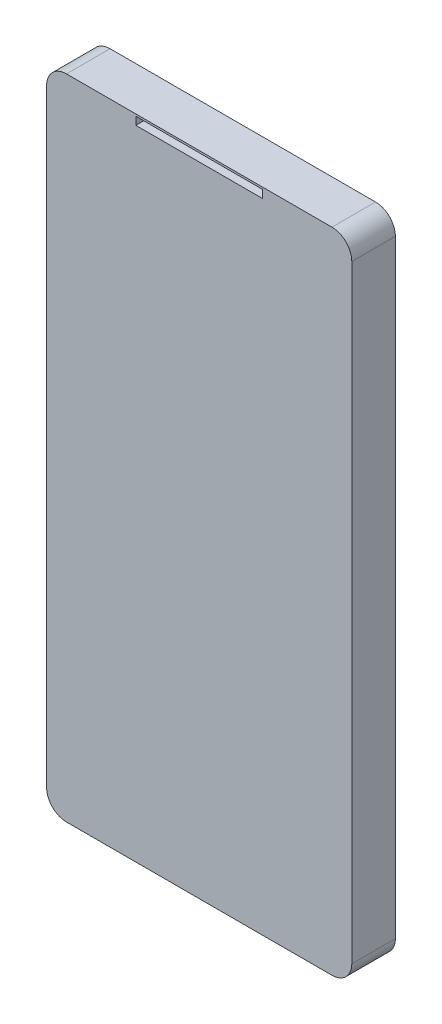
ISO-10303-21;
HEADER;
FILE_DESCRIPTION(('STEP AP214'),'2;1');
FILE_NAME('part.step','',(''),(''),'','','');
FILE_SCHEMA(('AUTOMOTIVE_DESIGN { 1 0 10303 214 1 1 1 1 }'));
ENDSEC;
DATA;
#1=APPLICATION_CONTEXT('core data for automotive mechanical design processes');
#2=APPLICATION_PROTOCOL_DEFINITION('international standard','automotive_design',2000,#1);
#3=PRODUCT_CONTEXT('',#1,'mechanical');
#4=PRODUCT('Part','Part','',(#3));
#5=PRODUCT_RELATED_PRODUCT_CATEGORY('part','',(#4));
#6=PRODUCT_DEFINITION_FORMATION('','',#4);
#7=PRODUCT_DEFINITION_CONTEXT('part definition',#1,'design');
#8=PRODUCT_DEFINITION('design','',#6,#7);
#9=PRODUCT_DEFINITION_SHAPE('','',#8);
#10=(LENGTH_UNIT() NAMED_UNIT(*) SI_UNIT(.MILLI.,.METRE.));
#11=(NAMED_UNIT(*) PLANE_ANGLE_UNIT() SI_UNIT($,.RADIAN.));
#12=(NAMED_UNIT(*) SI_UNIT($,.STERADIAN.) SOLID_ANGLE_UNIT());
#13=UNCERTAINTY_MEASURE_WITH_UNIT(LENGTH_MEASURE(1.E-05),#10,'distance_accuracy_value','');
#14=(GEOMETRIC_REPRESENTATION_CONTEXT(3) GLOBAL_UNCERTAINTY_ASSIGNED_CONTEXT((#13)) GLOBAL_UNIT_ASSIGNED_CONTEXT((#10,
#11,#12)) REPRESENTATION_CONTEXT('',''));
#15=CARTESIAN_POINT('',(0.,0.,0.));
#16=DIRECTION('',(0.,0.,1.));
#17=DIRECTION('',(1.,0.,0.));
#18=AXIS2_PLACEMENT_3D('',#15,#16,#17);
#19=CARTESIAN_POINT('',(0.,0.,0.));
#20=DIRECTION('',(0.,0.,1.));
#21=DIRECTION('',(1.,0.,0.));
#22=AXIS2_PLACEMENT_3D('',#19,#20,#21);
#23=PLANE('',#22);
#24=CARTESIAN_POINT('',(0.,0.,0.));
#25=DIRECTION('',(0.,0.,-1.));
#26=DIRECTION('',(1.,0.,0.));
#27=AXIS2_PLACEMENT_3D('',#24,#25,#26);
#28=CIRCLE('',#27,1.);
#29=CARTESIAN_POINT('',(1.,0.,0.));
#30=VERTEX_POINT('',#29);
#31=EDGE_CURVE('E529',#30,#30,#28,.T.);
#32=ORIENTED_EDGE('',*,*,#31,.F.);
#33=EDGE_LOOP('',(#32));
#34=FACE_BOUND('',#33,.T.);
#35=DIRECTION('',(0.,1.,0.));
#36=VECTOR('',#35,1.);
#37=CARTESIAN_POINT('',(38.5,81.75,0.));
#38=LINE('',#37,#36);
#39=CARTESIAN_POINT('',(38.5,-76.75,0.));
#40=VERTEX_POINT('',#39);
#41=CARTESIAN_POINT('',(38.5,76.75,0.));
#42=VERTEX_POINT('',#41);
#43=EDGE_CURVE('E571',#40,#42,#38,.T.);
#44=ORIENTED_EDGE('',*,*,#43,.F.);
#45=CARTESIAN_POINT('',(33.5,-76.75,0.));
#46=DIRECTION('',(0.,0.,1.));
#47=DIRECTION('',(1.,0.,0.));
#48=AXIS2_PLACEMENT_3D('',#45,#46,#47);
#49=CIRCLE('',#48,5.);
#50=CARTESIAN_POINT('',(33.5,-81.75,0.));
#51=VERTEX_POINT('',#50);
#52=EDGE_CURVE('E683',#40,#51,#49,.F.);
#53=ORIENTED_EDGE('',*,*,#52,.T.);
#54=DIRECTION('',(1.,0.,0.));
#55=VECTOR('',#54,1.);
#56=CARTESIAN_POINT('',(-38.5,-81.75,0.));
#57=LINE('',#56,#55);
#58=CARTESIAN_POINT('',(-33.5,-81.75,0.));
#59=VERTEX_POINT('',#58);
#60=EDGE_CURVE('E591',#59,#51,#57,.T.);
#61=ORIENTED_EDGE('',*,*,#60,.F.);
#62=CARTESIAN_POINT('',(-33.5,-76.75,0.));
#63=DIRECTION('',(0.,0.,1.));
#64=DIRECTION('',(1.,0.,0.));
#65=AXIS2_PLACEMENT_3D('',#62,#63,#64);
#66=CIRCLE('',#65,5.);
#67=CARTESIAN_POINT('',(-38.5,-76.75,0.));
#68=VERTEX_POINT('',#67);
#69=EDGE_CURVE('E680',#59,#68,#66,.F.);
#70=ORIENTED_EDGE('',*,*,#69,.T.);
#71=DIRECTION('',(0.,-1.,0.));
#72=VECTOR('',#71,1.);
#73=CARTESIAN_POINT('',(-38.5,81.75,0.));
#74=LINE('',#73,#72);
#75=CARTESIAN_POINT('',(-38.5,76.75,0.));
#76=VERTEX_POINT('',#75);
#77=EDGE_CURVE('E610',#76,#68,#74,.T.);
#78=ORIENTED_EDGE('',*,*,#77,.F.);
#79=CARTESIAN_POINT('',(-33.5,76.75,0.));
#80=DIRECTION('',(0.,0.,1.));
#81=DIRECTION('',(1.,0.,0.));
#82=AXIS2_PLACEMENT_3D('',#79,#80,#81);
#83=CIRCLE('',#82,5.);
#84=CARTESIAN_POINT('',(-33.5,81.75,0.));
#85=VERTEX_POINT('',#84);
#86=EDGE_CURVE('E677',#76,#85,#83,.F.);
#87=ORIENTED_EDGE('',*,*,#86,.T.);
#88=DIRECTION('',(-1.,0.,0.));
#89=VECTOR('',#88,1.);
#90=CARTESIAN_POINT('',(-38.5,81.75,0.));
#91=LINE('',#90,#89);
#92=CARTESIAN_POINT('',(33.5,81.75,0.));
#93=VERTEX_POINT('',#92);
#94=EDGE_CURVE('E606',#93,#85,#91,.T.);
#95=ORIENTED_EDGE('',*,*,#94,.F.);
#96=CARTESIAN_POINT('',(33.5,76.75,0.));
#97=DIRECTION('',(0.,0.,1.));
#98=DIRECTION('',(1.,0.,0.));
#99=AXIS2_PLACEMENT_3D('',#96,#97,#98);
#100=CIRCLE('',#99,5.);
#101=EDGE_CURVE('E674',#93,#42,#100,.F.);
#102=ORIENTED_EDGE('',*,*,#101,.T.);
#103=EDGE_LOOP('',(#44,#53,#61,#70,#78,#87,#95,#102));
#104=FACE_BOUND('',#103,.T.);
#105=DIRECTION('',(0.,-1.,0.));
#106=VECTOR('',#105,1.);
#107=CARTESIAN_POINT('',(31.5,78.75,0.));
#108=LINE('',#107,#106);
#109=CARTESIAN_POINT('',(31.5,73.75,0.));
#110=VERTEX_POINT('',#109);
#111=CARTESIAN_POINT('',(31.5,19.45,0.));
#112=VERTEX_POINT('',#111);
#113=EDGE_CURVE('E548',#110,#112,#108,.T.);
#114=ORIENTED_EDGE('',*,*,#113,.F.);
#115=CARTESIAN_POINT('',(26.5,73.75,0.));
#116=DIRECTION('',(0.,0.,1.));
#117=DIRECTION('',(1.,0.,0.));
#118=AXIS2_PLACEMENT_3D('',#115,#116,#117);
#119=CIRCLE('',#118,5.);
#120=CARTESIAN_POINT('',(26.5,78.75,0.));
#121=VERTEX_POINT('',#120);
#122=EDGE_CURVE('E661',#110,#121,#119,.T.);
#123=ORIENTED_EDGE('',*,*,#122,.T.);
#124=DIRECTION('',(1.,0.,0.));
#125=VECTOR('',#124,1.);
#126=CARTESIAN_POINT('',(31.5,78.75,0.));
#127=LINE('',#126,#125);
#128=CARTESIAN_POINT('',(3.5,78.75,0.));
#129=VERTEX_POINT('',#128);
#130=EDGE_CURVE('E559',#129,#121,#127,.T.);
#131=ORIENTED_EDGE('',*,*,#130,.F.);
#132=CARTESIAN_POINT('',(3.5,73.75,0.));
#133=DIRECTION('',(0.,0.,1.));
#134=DIRECTION('',(1.,0.,0.));
#135=AXIS2_PLACEMENT_3D('',#132,#133,#134);
#136=CIRCLE('',#135,5.);
#137=CARTESIAN_POINT('',(-1.5,73.75,0.));
#138=VERTEX_POINT('',#137);
#139=EDGE_CURVE('E664',#129,#138,#136,.T.);
#140=ORIENTED_EDGE('',*,*,#139,.T.);
#141=DIRECTION('',(0.,1.,0.));
#142=VECTOR('',#141,1.);
#143=CARTESIAN_POINT('',(-1.5,78.75,0.));
#144=LINE('',#143,#142);
#145=CARTESIAN_POINT('',(-1.50000000000001,19.45,0.));
#146=VERTEX_POINT('',#145);
#147=EDGE_CURVE('E579',#146,#138,#144,.T.);
#148=ORIENTED_EDGE('',*,*,#147,.F.);
#149=CARTESIAN_POINT('',(3.49999999999999,19.45,0.));
#150=DIRECTION('',(0.,0.,1.));
#151=DIRECTION('',(1.,0.,0.));
#152=AXIS2_PLACEMENT_3D('',#149,#150,#151);
#153=CIRCLE('',#152,5.);
#154=CARTESIAN_POINT('',(3.49999999999999,14.45,0.));
#155=VERTEX_POINT('',#154);
#156=EDGE_CURVE('E658',#146,#155,#153,.T.);
#157=ORIENTED_EDGE('',*,*,#156,.T.);
#158=DIRECTION('',(-1.,0.,0.));
#159=VECTOR('',#158,1.);
#160=CARTESIAN_POINT('',(31.5,14.45,0.));
#161=LINE('',#160,#159);
#162=CARTESIAN_POINT('',(26.5,14.45,0.));
#163=VERTEX_POINT('',#162);
#164=EDGE_CURVE('E575',#163,#155,#161,.T.);
#165=ORIENTED_EDGE('',*,*,#164,.F.);
#166=CARTESIAN_POINT('',(26.5,19.45,0.));
#167=DIRECTION('',(0.,0.,1.));
#168=DIRECTION('',(1.,0.,0.));
#169=AXIS2_PLACEMENT_3D('',#166,#167,#168);
#170=CIRCLE('',#169,5.);
#171=EDGE_CURVE('E655',#163,#112,#170,.T.);
#172=ORIENTED_EDGE('',*,*,#171,.T.);
#173=EDGE_LOOP('',(#114,#123,#131,#140,#148,#157,#165,#172));
#174=FACE_BOUND('',#173,.T.);
#175=ADVANCED_FACE('F360',(#34,#104,#174),#23,.F.);
#176=CARTESIAN_POINT('',(38.5,81.75,11.));
#177=DIRECTION('',(-1.,0.,0.));
#178=DIRECTION('',(0.,-1.,0.));
#179=AXIS2_PLACEMENT_3D('',#176,#177,#178);
#180=PLANE('',#179);
#181=DIRECTION('',(0.,1.,0.));
#182=VECTOR('',#181,1.);
#183=CARTESIAN_POINT('',(38.5,81.75,11.));
#184=LINE('',#183,#182);
#185=CARTESIAN_POINT('',(38.5,-76.75,11.));
#186=VERTEX_POINT('',#185);
#187=CARTESIAN_POINT('',(38.5,76.75,11.));
#188=VERTEX_POINT('',#187);
#189=EDGE_CURVE('E586',#186,#188,#184,.T.);
#190=ORIENTED_EDGE('',*,*,#189,.F.);
#191=DIRECTION('',(0.,0.,-1.));
#192=VECTOR('',#191,1.);
#193=CARTESIAN_POINT('',(38.5,-76.75,11.));
#194=LINE('',#193,#192);
#195=EDGE_CURVE('E670',#186,#40,#194,.T.);
#196=ORIENTED_EDGE('',*,*,#195,.T.);
#197=ORIENTED_EDGE('',*,*,#43,.T.);
#198=DIRECTION('',(0.,0.,-1.));
#199=VECTOR('',#198,1.);
#200=CARTESIAN_POINT('',(38.5,76.75,11.));
#201=LINE('',#200,#199);
#202=EDGE_CURVE('E667',#42,#188,#201,.F.);
#203=ORIENTED_EDGE('',*,*,#202,.T.);
#204=EDGE_LOOP('',(#190,#196,#197,#203));
#205=FACE_BOUND('',#204,.T.);
#206=ADVANCED_FACE('F746',(#205),#180,.F.);
#207=CARTESIAN_POINT('',(-38.5,81.75,11.));
#208=DIRECTION('',(0.,-1.,0.));
#209=DIRECTION('',(0.,0.,-1.));
#210=AXIS2_PLACEMENT_3D('',#207,#208,#209);
#211=PLANE('',#210);
#212=ORIENTED_EDGE('',*,*,#94,.T.);
#213=DIRECTION('',(0.,0.,-1.));
#214=VECTOR('',#213,1.);
#215=CARTESIAN_POINT('',(-33.5,81.75,11.));
#216=LINE('',#215,#214);
#217=CARTESIAN_POINT('',(-33.5,81.75,11.));
#218=VERTEX_POINT('',#217);
#219=EDGE_CURVE('E13',#85,#218,#216,.F.);
#220=ORIENTED_EDGE('',*,*,#219,.T.);
#221=DIRECTION('',(-1.,0.,0.));
#222=VECTOR('',#221,1.);
#223=CARTESIAN_POINT('',(-38.5,81.75,11.));
#224=LINE('',#223,#222);
#225=CARTESIAN_POINT('',(33.5,81.75,11.));
#226=VERTEX_POINT('',#225);
#227=EDGE_CURVE('E590',#226,#218,#224,.T.);
#228=ORIENTED_EDGE('',*,*,#227,.F.);
#229=DIRECTION('',(0.,0.,-1.));
#230=VECTOR('',#229,1.);
#231=CARTESIAN_POINT('',(33.5,81.75,11.));
#232=LINE('',#231,#230);
#233=EDGE_CURVE('E369',#226,#93,#232,.T.);
#234=ORIENTED_EDGE('',*,*,#233,.T.);
#235=EDGE_LOOP('',(#212,#220,#228,#234));
#236=FACE_BOUND('',#235,.T.);
#237=ADVANCED_FACE('F716',(#236),#211,.F.);
#238=CARTESIAN_POINT('',(-38.5,81.75,11.));
#239=DIRECTION('',(1.,0.,0.));
#240=DIRECTION('',(0.,1.,0.));
#241=AXIS2_PLACEMENT_3D('',#238,#239,#240);
#242=PLANE('',#241);
#243=ORIENTED_EDGE('',*,*,#77,.T.);
#244=DIRECTION('',(0.,0.,-1.));
#245=VECTOR('',#244,1.);
#246=CARTESIAN_POINT('',(-38.5,-76.75,11.));
#247=LINE('',#246,#245);
#248=CARTESIAN_POINT('',(-38.5,-76.75,11.));
#249=VERTEX_POINT('',#248);
#250=EDGE_CURVE('E384',#68,#249,#247,.F.);
#251=ORIENTED_EDGE('',*,*,#250,.T.);
#252=DIRECTION('',(0.,-1.,0.));
#253=VECTOR('',#252,1.);
#254=CARTESIAN_POINT('',(-38.5,81.75,11.));
#255=LINE('',#254,#253);
#256=CARTESIAN_POINT('',(-38.5,76.75,11.));
#257=VERTEX_POINT('',#256);
#258=EDGE_CURVE('E595',#257,#249,#255,.T.);
#259=ORIENTED_EDGE('',*,*,#258,.F.);
#260=DIRECTION('',(0.,0.,-1.));
#261=VECTOR('',#260,1.);
#262=CARTESIAN_POINT('',(-38.5,76.75,11.));
#263=LINE('',#262,#261);
#264=EDGE_CURVE('E705',#257,#76,#263,.T.);
#265=ORIENTED_EDGE('',*,*,#264,.T.);
#266=EDGE_LOOP('',(#243,#251,#259,#265));
#267=FACE_BOUND('',#266,.T.);
#268=ADVANCED_FACE('F728',(#267),#242,.F.);
#269=CARTESIAN_POINT('',(-38.5,-81.75,11.));
#270=DIRECTION('',(0.,1.,0.));
#271=DIRECTION('',(0.,0.,1.));
#272=AXIS2_PLACEMENT_3D('',#269,#270,#271);
#273=PLANE('',#272);
#274=ORIENTED_EDGE('',*,*,#60,.T.);
#275=DIRECTION('',(0.,0.,-1.));
#276=VECTOR('',#275,1.);
#277=CARTESIAN_POINT('',(33.5,-81.75,11.));
#278=LINE('',#277,#276);
#279=CARTESIAN_POINT('',(33.5,-81.75,11.));
#280=VERTEX_POINT('',#279);
#281=EDGE_CURVE('E690',#51,#280,#278,.F.);
#282=ORIENTED_EDGE('',*,*,#281,.T.);
#283=DIRECTION('',(1.,0.,0.));
#284=VECTOR('',#283,1.);
#285=CARTESIAN_POINT('',(-38.5,-81.75,11.));
#286=LINE('',#285,#284);
#287=CARTESIAN_POINT('',(-33.5,-81.75,11.));
#288=VERTEX_POINT('',#287);
#289=EDGE_CURVE('E598',#288,#280,#286,.T.);
#290=ORIENTED_EDGE('',*,*,#289,.F.);
#291=DIRECTION('',(0.,0.,-1.));
#292=VECTOR('',#291,1.);
#293=CARTESIAN_POINT('',(-33.5,-81.75,11.));
#294=LINE('',#293,#292);
#295=EDGE_CURVE('E686',#288,#59,#294,.T.);
#296=ORIENTED_EDGE('',*,*,#295,.T.);
#297=EDGE_LOOP('',(#274,#282,#290,#296));
#298=FACE_BOUND('',#297,.T.);
#299=ADVANCED_FACE('F738',(#298),#273,.F.);
#300=CARTESIAN_POINT('',(0.,0.,11.));
#301=DIRECTION('',(0.,0.,1.));
#302=DIRECTION('',(1.,0.,0.));
#303=AXIS2_PLACEMENT_3D('',#300,#301,#302);
#304=PLANE('',#303);
#305=DIRECTION('',(0.,-1.,0.));
#306=VECTOR('',#305,1.);
#307=CARTESIAN_POINT('',(-16.,81.25,11.));
#308=LINE('',#307,#306);
#309=CARTESIAN_POINT('',(-16.,81.25,11.));
#310=VERTEX_POINT('',#309);
#311=CARTESIAN_POINT('',(-16.,79.25,11.));
#312=VERTEX_POINT('',#311);
#313=EDGE_CURVE('E376',#310,#312,#308,.T.);
#314=ORIENTED_EDGE('',*,*,#313,.F.);
#315=DIRECTION('',(-1.,0.,0.));
#316=VECTOR('',#315,1.);
#317=CARTESIAN_POINT('',(-16.,81.25,11.));
#318=LINE('',#317,#316);
#319=CARTESIAN_POINT('',(16.,81.25,11.));
#320=VERTEX_POINT('',#319);
#321=EDGE_CURVE('E522',#320,#310,#318,.T.);
#322=ORIENTED_EDGE('',*,*,#321,.F.);
#323=DIRECTION('',(0.,1.,0.));
#324=VECTOR('',#323,1.);
#325=CARTESIAN_POINT('',(16.,81.25,11.));
#326=LINE('',#325,#324);
#327=CARTESIAN_POINT('',(16.,79.25,11.));
#328=VERTEX_POINT('',#327);
#329=EDGE_CURVE('E526',#328,#320,#326,.T.);
#330=ORIENTED_EDGE('',*,*,#329,.F.);
#331=DIRECTION('',(1.,0.,0.));
#332=VECTOR('',#331,1.);
#333=CARTESIAN_POINT('',(-16.,79.25,11.));
#334=LINE('',#333,#332);
#335=EDGE_CURVE('E538',#312,#328,#334,.T.);
#336=ORIENTED_EDGE('',*,*,#335,.F.);
#337=EDGE_LOOP('',(#314,#322,#330,#336));
#338=FACE_BOUND('',#337,.T.);
#339=ORIENTED_EDGE('',*,*,#289,.T.);
#340=CARTESIAN_POINT('',(33.5,-76.75,11.));
#341=DIRECTION('',(0.,0.,1.));
#342=DIRECTION('',(1.,0.,0.));
#343=AXIS2_PLACEMENT_3D('',#340,#341,#342);
#344=CIRCLE('',#343,5.);
#345=EDGE_CURVE('E702',#280,#186,#344,.T.);
#346=ORIENTED_EDGE('',*,*,#345,.T.);
#347=ORIENTED_EDGE('',*,*,#189,.T.);
#348=CARTESIAN_POINT('',(33.5,76.75,11.));
#349=DIRECTION('',(0.,0.,1.));
#350=DIRECTION('',(1.,0.,0.));
#351=AXIS2_PLACEMENT_3D('',#348,#349,#350);
#352=CIRCLE('',#351,5.);
#353=EDGE_CURVE('E693',#188,#226,#352,.T.);
#354=ORIENTED_EDGE('',*,*,#353,.T.);
#355=ORIENTED_EDGE('',*,*,#227,.T.);
#356=CARTESIAN_POINT('',(-33.5,76.75,11.));
#357=DIRECTION('',(0.,0.,1.));
#358=DIRECTION('',(1.,0.,0.));
#359=AXIS2_PLACEMENT_3D('',#356,#357,#358);
#360=CIRCLE('',#359,5.);
#361=EDGE_CURVE('E696',#218,#257,#360,.T.);
#362=ORIENTED_EDGE('',*,*,#361,.T.);
#363=ORIENTED_EDGE('',*,*,#258,.T.);
#364=CARTESIAN_POINT('',(-33.5,-76.75,11.));
#365=DIRECTION('',(0.,0.,1.));
#366=DIRECTION('',(1.,0.,0.));
#367=AXIS2_PLACEMENT_3D('',#364,#365,#366);
#368=CIRCLE('',#367,5.);
#369=EDGE_CURVE('E699',#249,#288,#368,.T.);
#370=ORIENTED_EDGE('',*,*,#369,.T.);
#371=EDGE_LOOP('',(#339,#346,#347,#354,#355,#362,#363,#370));
#372=FACE_BOUND('',#371,.T.);
#373=ADVANCED_FACE('F731',(#338,#372),#304,.T.);
#374=CARTESIAN_POINT('',(31.5,78.75,-2.1));
#375=DIRECTION('',(-1.,0.,0.));
#376=DIRECTION('',(0.,-1.,0.));
#377=AXIS2_PLACEMENT_3D('',#374,#375,#376);
#378=PLANE('',#377);
#379=ORIENTED_EDGE('',*,*,#113,.T.);
#380=DIRECTION('',(0.,0.,1.));
#381=VECTOR('',#380,1.);
#382=CARTESIAN_POINT('',(31.5,19.45,-2.1));
#383=LINE('',#382,#381);
#384=CARTESIAN_POINT('',(31.5,19.45,-2.1));
#385=VERTEX_POINT('',#384);
#386=EDGE_CURVE('E626',#112,#385,#383,.F.);
#387=ORIENTED_EDGE('',*,*,#386,.T.);
#388=DIRECTION('',(0.,-1.,0.));
#389=VECTOR('',#388,1.);
#390=CARTESIAN_POINT('',(31.5,78.75,-2.1));
#391=LINE('',#390,#389);
#392=CARTESIAN_POINT('',(31.5,73.75,-2.1));
#393=VERTEX_POINT('',#392);
#394=EDGE_CURVE('E554',#393,#385,#391,.T.);
#395=ORIENTED_EDGE('',*,*,#394,.F.);
#396=DIRECTION('',(0.,0.,1.));
#397=VECTOR('',#396,1.);
#398=CARTESIAN_POINT('',(31.5,73.75,-2.1));
#399=LINE('',#398,#397);
#400=EDGE_CURVE('E622',#393,#110,#399,.T.);
#401=ORIENTED_EDGE('',*,*,#400,.T.);
#402=EDGE_LOOP('',(#379,#387,#395,#401));
#403=FACE_BOUND('',#402,.T.);
#404=ADVANCED_FACE('F814',(#403),#378,.F.);
#405=CARTESIAN_POINT('',(31.5,14.45,-2.1));
#406=DIRECTION('',(0.,1.,0.));
#407=DIRECTION('',(0.,0.,1.));
#408=AXIS2_PLACEMENT_3D('',#405,#406,#407);
#409=PLANE('',#408);
#410=DIRECTION('',(-1.,0.,0.));
#411=VECTOR('',#410,1.);
#412=CARTESIAN_POINT('',(31.5,14.45,-2.1));
#413=LINE('',#412,#411);
#414=CARTESIAN_POINT('',(26.5,14.45,-2.1));
#415=VERTEX_POINT('',#414);
#416=CARTESIAN_POINT('',(3.49999999999999,14.45,-2.1));
#417=VERTEX_POINT('',#416);
#418=EDGE_CURVE('E558',#415,#417,#413,.T.);
#419=ORIENTED_EDGE('',*,*,#418,.F.);
#420=DIRECTION('',(0.,0.,1.));
#421=VECTOR('',#420,1.);
#422=CARTESIAN_POINT('',(26.5,14.45,-2.1));
#423=LINE('',#422,#421);
#424=EDGE_CURVE('E618',#415,#163,#423,.T.);
#425=ORIENTED_EDGE('',*,*,#424,.T.);
#426=ORIENTED_EDGE('',*,*,#164,.T.);
#427=DIRECTION('',(0.,0.,1.));
#428=VECTOR('',#427,1.);
#429=CARTESIAN_POINT('',(3.49999999999999,14.45,-2.1));
#430=LINE('',#429,#428);
#431=EDGE_CURVE('E602',#155,#417,#430,.F.);
#432=ORIENTED_EDGE('',*,*,#431,.T.);
#433=EDGE_LOOP('',(#419,#425,#426,#432));
#434=FACE_BOUND('',#433,.T.);
#435=ADVANCED_FACE('F897',(#434),#409,.F.);
#436=CARTESIAN_POINT('',(-1.5,78.75,-2.1));
#437=DIRECTION('',(1.,0.,0.));
#438=DIRECTION('',(0.,1.,0.));
#439=AXIS2_PLACEMENT_3D('',#436,#437,#438);
#440=PLANE('',#439);
#441=DIRECTION('',(0.,1.,0.));
#442=VECTOR('',#441,1.);
#443=CARTESIAN_POINT('',(-1.5,78.75,-2.1));
#444=LINE('',#443,#442);
#445=CARTESIAN_POINT('',(-1.50000000000001,19.45,-2.1));
#446=VERTEX_POINT('',#445);
#447=CARTESIAN_POINT('',(-1.5,73.75,-2.1));
#448=VERTEX_POINT('',#447);
#449=EDGE_CURVE('E563',#446,#448,#444,.T.);
#450=ORIENTED_EDGE('',*,*,#449,.F.);
#451=DIRECTION('',(0.,0.,1.));
#452=VECTOR('',#451,1.);
#453=CARTESIAN_POINT('',(-1.50000000000001,19.45,-2.1));
#454=LINE('',#453,#452);
#455=EDGE_CURVE('E644',#446,#146,#454,.T.);
#456=ORIENTED_EDGE('',*,*,#455,.T.);
#457=ORIENTED_EDGE('',*,*,#147,.T.);
#458=DIRECTION('',(0.,0.,1.));
#459=VECTOR('',#458,1.);
#460=CARTESIAN_POINT('',(-1.5,73.75,-2.1));
#461=LINE('',#460,#459);
#462=EDGE_CURVE('E641',#138,#448,#461,.F.);
#463=ORIENTED_EDGE('',*,*,#462,.T.);
#464=EDGE_LOOP('',(#450,#456,#457,#463));
#465=FACE_BOUND('',#464,.T.);
#466=ADVANCED_FACE('F893',(#465),#440,.F.);
#467=CARTESIAN_POINT('',(31.5,78.75,-2.1));
#468=DIRECTION('',(0.,-1.,0.));
#469=DIRECTION('',(0.,0.,-1.));
#470=AXIS2_PLACEMENT_3D('',#467,#468,#469);
#471=PLANE('',#470);
#472=ORIENTED_EDGE('',*,*,#130,.T.);
#473=DIRECTION('',(0.,0.,1.));
#474=VECTOR('',#473,1.);
#475=CARTESIAN_POINT('',(26.5,78.75,-2.1));
#476=LINE('',#475,#474);
#477=CARTESIAN_POINT('',(26.5,78.75,-2.1));
#478=VERTEX_POINT('',#477);
#479=EDGE_CURVE('E652',#121,#478,#476,.F.);
#480=ORIENTED_EDGE('',*,*,#479,.T.);
#481=DIRECTION('',(1.,0.,0.));
#482=VECTOR('',#481,1.);
#483=CARTESIAN_POINT('',(31.5,78.75,-2.1));
#484=LINE('',#483,#482);
#485=CARTESIAN_POINT('',(3.5,78.75,-2.1));
#486=VERTEX_POINT('',#485);
#487=EDGE_CURVE('E567',#486,#478,#484,.T.);
#488=ORIENTED_EDGE('',*,*,#487,.F.);
#489=DIRECTION('',(0.,0.,1.));
#490=VECTOR('',#489,1.);
#491=CARTESIAN_POINT('',(3.5,78.75,-2.1));
#492=LINE('',#491,#490);
#493=EDGE_CURVE('E648',#486,#129,#492,.T.);
#494=ORIENTED_EDGE('',*,*,#493,.T.);
#495=EDGE_LOOP('',(#472,#480,#488,#494));
#496=FACE_BOUND('',#495,.T.);
#497=ADVANCED_FACE('F889',(#496),#471,.F.);
#498=CARTESIAN_POINT('',(0.,0.,-2.1));
#499=DIRECTION('',(0.,0.,-1.));
#500=DIRECTION('',(-1.,0.,0.));
#501=AXIS2_PLACEMENT_3D('',#498,#499,#500);
#502=PLANE('',#501);
#503=ORIENTED_EDGE('',*,*,#394,.T.);
#504=CARTESIAN_POINT('',(26.5,19.45,-2.1));
#505=DIRECTION('',(0.,0.,-1.));
#506=DIRECTION('',(-1.,0.,0.));
#507=AXIS2_PLACEMENT_3D('',#504,#505,#506);
#508=CIRCLE('',#507,5.);
#509=EDGE_CURVE('E638',#385,#415,#508,.T.);
#510=ORIENTED_EDGE('',*,*,#509,.T.);
#511=ORIENTED_EDGE('',*,*,#418,.T.);
#512=CARTESIAN_POINT('',(3.49999999999999,19.45,-2.1));
#513=DIRECTION('',(0.,0.,-1.));
#514=DIRECTION('',(-1.,0.,0.));
#515=AXIS2_PLACEMENT_3D('',#512,#513,#514);
#516=CIRCLE('',#515,5.);
#517=EDGE_CURVE('E635',#417,#446,#516,.T.);
#518=ORIENTED_EDGE('',*,*,#517,.T.);
#519=ORIENTED_EDGE('',*,*,#449,.T.);
#520=CARTESIAN_POINT('',(3.5,73.75,-2.1));
#521=DIRECTION('',(0.,0.,-1.));
#522=DIRECTION('',(-1.,0.,0.));
#523=AXIS2_PLACEMENT_3D('',#520,#521,#522);
#524=CIRCLE('',#523,5.);
#525=EDGE_CURVE('E629',#448,#486,#524,.T.);
#526=ORIENTED_EDGE('',*,*,#525,.T.);
#527=ORIENTED_EDGE('',*,*,#487,.T.);
#528=CARTESIAN_POINT('',(26.5,73.75,-2.1));
#529=DIRECTION('',(0.,0.,-1.));
#530=DIRECTION('',(-1.,0.,0.));
#531=AXIS2_PLACEMENT_3D('',#528,#529,#530);
#532=CIRCLE('',#531,5.);
#533=EDGE_CURVE('E632',#478,#393,#532,.T.);
#534=ORIENTED_EDGE('',*,*,#533,.T.);
#535=EDGE_LOOP('',(#503,#510,#511,#518,#519,#526,#527,#534));
#536=FACE_BOUND('',#535,.T.);
#537=ADVANCED_FACE('F776',(#536),#502,.T.);
#538=CARTESIAN_POINT('',(26.5,19.45,-2.1));
#539=DIRECTION('',(0.,0.,1.));
#540=DIRECTION('',(1.,0.,0.));
#541=AXIS2_PLACEMENT_3D('',#538,#539,#540);
#542=CYLINDRICAL_SURFACE('',#541,5.);
#543=ORIENTED_EDGE('',*,*,#509,.F.);
#544=ORIENTED_EDGE('',*,*,#386,.F.);
#545=ORIENTED_EDGE('',*,*,#171,.F.);
#546=ORIENTED_EDGE('',*,*,#424,.F.);
#547=EDGE_LOOP('',(#543,#544,#545,#546));
#548=FACE_BOUND('',#547,.T.);
#549=ADVANCED_FACE('F772',(#548),#542,.T.);
#550=CARTESIAN_POINT('',(3.49999999999999,19.45,-2.1));
#551=DIRECTION('',(0.,0.,1.));
#552=DIRECTION('',(1.,0.,0.));
#553=AXIS2_PLACEMENT_3D('',#550,#551,#552);
#554=CYLINDRICAL_SURFACE('',#553,5.);
#555=ORIENTED_EDGE('',*,*,#517,.F.);
#556=ORIENTED_EDGE('',*,*,#431,.F.);
#557=ORIENTED_EDGE('',*,*,#156,.F.);
#558=ORIENTED_EDGE('',*,*,#455,.F.);
#559=EDGE_LOOP('',(#555,#556,#557,#558));
#560=FACE_BOUND('',#559,.T.);
#561=ADVANCED_FACE('F775',(#560),#554,.T.);
#562=CARTESIAN_POINT('',(26.5,73.75,-2.1));
#563=DIRECTION('',(0.,0.,1.));
#564=DIRECTION('',(1.,0.,0.));
#565=AXIS2_PLACEMENT_3D('',#562,#563,#564);
#566=CYLINDRICAL_SURFACE('',#565,5.);
#567=ORIENTED_EDGE('',*,*,#533,.F.);
#568=ORIENTED_EDGE('',*,*,#479,.F.);
#569=ORIENTED_EDGE('',*,*,#122,.F.);
#570=ORIENTED_EDGE('',*,*,#400,.F.);
#571=EDGE_LOOP('',(#567,#568,#569,#570));
#572=FACE_BOUND('',#571,.T.);
#573=ADVANCED_FACE('F780',(#572),#566,.T.);
#574=CARTESIAN_POINT('',(3.5,73.75,-2.1));
#575=DIRECTION('',(0.,0.,1.));
#576=DIRECTION('',(1.,0.,0.));
#577=AXIS2_PLACEMENT_3D('',#574,#575,#576);
#578=CYLINDRICAL_SURFACE('',#577,5.);
#579=ORIENTED_EDGE('',*,*,#525,.F.);
#580=ORIENTED_EDGE('',*,*,#462,.F.);
#581=ORIENTED_EDGE('',*,*,#139,.F.);
#582=ORIENTED_EDGE('',*,*,#493,.F.);
#583=EDGE_LOOP('',(#579,#580,#581,#582));
#584=FACE_BOUND('',#583,.T.);
#585=ADVANCED_FACE('F784',(#584),#578,.T.);
#586=CARTESIAN_POINT('',(33.5,-76.75,11.));
#587=DIRECTION('',(0.,0.,-1.));
#588=DIRECTION('',(-1.,0.,0.));
#589=AXIS2_PLACEMENT_3D('',#586,#587,#588);
#590=CYLINDRICAL_SURFACE('',#589,5.);
#591=ORIENTED_EDGE('',*,*,#345,.F.);
#592=ORIENTED_EDGE('',*,*,#281,.F.);
#593=ORIENTED_EDGE('',*,*,#52,.F.);
#594=ORIENTED_EDGE('',*,*,#195,.F.);
#595=EDGE_LOOP('',(#591,#592,#593,#594));
#596=FACE_BOUND('',#595,.T.);
#597=ADVANCED_FACE('F743',(#596),#590,.T.);
#598=CARTESIAN_POINT('',(-33.5,-76.75,11.));
#599=DIRECTION('',(0.,0.,-1.));
#600=DIRECTION('',(-1.,0.,0.));
#601=AXIS2_PLACEMENT_3D('',#598,#599,#600);
#602=CYLINDRICAL_SURFACE('',#601,5.);
#603=ORIENTED_EDGE('',*,*,#369,.F.);
#604=ORIENTED_EDGE('',*,*,#250,.F.);
#605=ORIENTED_EDGE('',*,*,#69,.F.);
#606=ORIENTED_EDGE('',*,*,#295,.F.);
#607=EDGE_LOOP('',(#603,#604,#605,#606));
#608=FACE_BOUND('',#607,.T.);
#609=ADVANCED_FACE('F735',(#608),#602,.T.);
#610=CARTESIAN_POINT('',(-33.5,76.75,11.));
#611=DIRECTION('',(0.,0.,-1.));
#612=DIRECTION('',(-1.,0.,0.));
#613=AXIS2_PLACEMENT_3D('',#610,#611,#612);
#614=CYLINDRICAL_SURFACE('',#613,5.);
#615=ORIENTED_EDGE('',*,*,#361,.F.);
#616=ORIENTED_EDGE('',*,*,#219,.F.);
#617=ORIENTED_EDGE('',*,*,#86,.F.);
#618=ORIENTED_EDGE('',*,*,#264,.F.);
#619=EDGE_LOOP('',(#615,#616,#617,#618));
#620=FACE_BOUND('',#619,.T.);
#621=ADVANCED_FACE('F727',(#620),#614,.T.);
#622=CARTESIAN_POINT('',(33.5,76.75,11.));
#623=DIRECTION('',(0.,0.,-1.));
#624=DIRECTION('',(-1.,0.,0.));
#625=AXIS2_PLACEMENT_3D('',#622,#623,#624);
#626=CYLINDRICAL_SURFACE('',#625,5.);
#627=ORIENTED_EDGE('',*,*,#353,.F.);
#628=ORIENTED_EDGE('',*,*,#202,.F.);
#629=ORIENTED_EDGE('',*,*,#101,.F.);
#630=ORIENTED_EDGE('',*,*,#233,.F.);
#631=EDGE_LOOP('',(#627,#628,#629,#630));
#632=FACE_BOUND('',#631,.T.);
#633=ADVANCED_FACE('F362',(#632),#626,.T.);
#634=CARTESIAN_POINT('',(-16.,81.25,9.));
#635=DIRECTION('',(-1.,0.,0.));
#636=DIRECTION('',(0.,-1.,0.));
#637=AXIS2_PLACEMENT_3D('',#634,#635,#636);
#638=PLANE('',#637);
#639=ORIENTED_EDGE('',*,*,#313,.T.);
#640=DIRECTION('',(0.,0.,1.));
#641=VECTOR('',#640,1.);
#642=CARTESIAN_POINT('',(-16.,79.25,9.));
#643=LINE('',#642,#641);
#644=CARTESIAN_POINT('',(-16.,79.25,9.));
#645=VERTEX_POINT('',#644);
#646=EDGE_CURVE('E497',#645,#312,#643,.T.);
#647=ORIENTED_EDGE('',*,*,#646,.F.);
#648=DIRECTION('',(0.,-1.,0.));
#649=VECTOR('',#648,1.);
#650=CARTESIAN_POINT('',(-16.,81.25,9.));
#651=LINE('',#650,#649);
#652=CARTESIAN_POINT('',(-16.,81.25,9.));
#653=VERTEX_POINT('',#652);
#654=EDGE_CURVE('E501',#653,#645,#651,.T.);
#655=ORIENTED_EDGE('',*,*,#654,.F.);
#656=DIRECTION('',(0.,0.,1.));
#657=VECTOR('',#656,1.);
#658=CARTESIAN_POINT('',(-16.,81.25,9.));
#659=LINE('',#658,#657);
#660=EDGE_CURVE('E545',#653,#310,#659,.T.);
#661=ORIENTED_EDGE('',*,*,#660,.T.);
#662=EDGE_LOOP('',(#639,#647,#655,#661));
#663=FACE_BOUND('',#662,.T.);
#664=ADVANCED_FACE('F499',(#663),#638,.F.);
#665=CARTESIAN_POINT('',(-16.,81.25,9.));
#666=DIRECTION('',(0.,1.,0.));
#667=DIRECTION('',(0.,0.,1.));
#668=AXIS2_PLACEMENT_3D('',#665,#666,#667);
#669=PLANE('',#668);
#670=ORIENTED_EDGE('',*,*,#321,.T.);
#671=ORIENTED_EDGE('',*,*,#660,.F.);
#672=DIRECTION('',(-1.,0.,0.));
#673=VECTOR('',#672,1.);
#674=CARTESIAN_POINT('',(-16.,81.25,9.));
#675=LINE('',#674,#673);
#676=CARTESIAN_POINT('',(16.,81.25,9.));
#677=VERTEX_POINT('',#676);
#678=EDGE_CURVE('E508',#677,#653,#675,.T.);
#679=ORIENTED_EDGE('',*,*,#678,.F.);
#680=DIRECTION('',(0.,0.,1.));
#681=VECTOR('',#680,1.);
#682=CARTESIAN_POINT('',(16.,81.25,9.));
#683=LINE('',#682,#681);
#684=EDGE_CURVE('E549',#677,#320,#683,.T.);
#685=ORIENTED_EDGE('',*,*,#684,.T.);
#686=EDGE_LOOP('',(#670,#671,#679,#685));
#687=FACE_BOUND('',#686,.T.);
#688=ADVANCED_FACE('F753',(#687),#669,.F.);
#689=CARTESIAN_POINT('',(16.,81.25,9.));
#690=DIRECTION('',(1.,0.,0.));
#691=DIRECTION('',(0.,0.,-1.));
#692=AXIS2_PLACEMENT_3D('',#689,#690,#691);
#693=PLANE('',#692);
#694=ORIENTED_EDGE('',*,*,#329,.T.);
#695=ORIENTED_EDGE('',*,*,#684,.F.);
#696=DIRECTION('',(0.,1.,0.));
#697=VECTOR('',#696,1.);
#698=CARTESIAN_POINT('',(16.,81.25,9.));
#699=LINE('',#698,#697);
#700=CARTESIAN_POINT('',(16.,79.25,9.));
#701=VERTEX_POINT('',#700);
#702=EDGE_CURVE('E517',#701,#677,#699,.T.);
#703=ORIENTED_EDGE('',*,*,#702,.F.);
#704=DIRECTION('',(0.,0.,1.));
#705=VECTOR('',#704,1.);
#706=CARTESIAN_POINT('',(16.,79.25,9.));
#707=LINE('',#706,#705);
#708=EDGE_CURVE('E507',#701,#328,#707,.T.);
#709=ORIENTED_EDGE('',*,*,#708,.T.);
#710=EDGE_LOOP('',(#694,#695,#703,#709));
#711=FACE_BOUND('',#710,.T.);
#712=ADVANCED_FACE('F831',(#711),#693,.F.);
#713=CARTESIAN_POINT('',(-16.,79.25,9.));
#714=DIRECTION('',(0.,-1.,0.));
#715=DIRECTION('',(0.,0.,-1.));
#716=AXIS2_PLACEMENT_3D('',#713,#714,#715);
#717=PLANE('',#716);
#718=ORIENTED_EDGE('',*,*,#335,.T.);
#719=ORIENTED_EDGE('',*,*,#708,.F.);
#720=DIRECTION('',(1.,0.,0.));
#721=VECTOR('',#720,1.);
#722=CARTESIAN_POINT('',(-16.,79.25,9.));
#723=LINE('',#722,#721);
#724=EDGE_CURVE('E511',#645,#701,#723,.T.);
#725=ORIENTED_EDGE('',*,*,#724,.F.);
#726=ORIENTED_EDGE('',*,*,#646,.T.);
#727=EDGE_LOOP('',(#718,#719,#725,#726));
#728=FACE_BOUND('',#727,.T.);
#729=ADVANCED_FACE('F512',(#728),#717,.F.);
#730=CARTESIAN_POINT('',(0.,0.,9.));
#731=DIRECTION('',(0.,0.,1.));
#732=DIRECTION('',(1.,0.,0.));
#733=AXIS2_PLACEMENT_3D('',#730,#731,#732);
#734=PLANE('',#733);
#735=ORIENTED_EDGE('',*,*,#654,.T.);
#736=ORIENTED_EDGE('',*,*,#724,.T.);
#737=ORIENTED_EDGE('',*,*,#702,.T.);
#738=ORIENTED_EDGE('',*,*,#678,.T.);
#739=EDGE_LOOP('',(#735,#736,#737,#738));
#740=FACE_BOUND('',#739,.T.);
#741=ADVANCED_FACE('F519',(#740),#734,.T.);
#742=CARTESIAN_POINT('',(0.,0.,0.));
#743=DIRECTION('',(0.,0.,1.));
#744=DIRECTION('',(1.,0.,0.));
#745=AXIS2_PLACEMENT_3D('',#742,#743,#744);
#746=CYLINDRICAL_SURFACE('',#745,1.);
#747=CARTESIAN_POINT('',(0.,0.,-0.01));
#748=DIRECTION('',(0.,0.,-1.));
#749=DIRECTION('',(-1.,0.,0.));
#750=AXIS2_PLACEMENT_3D('',#747,#748,#749);
#751=CIRCLE('',#750,1.);
#752=CARTESIAN_POINT('',(-1.,0.,-0.01));
#753=VERTEX_POINT('',#752);
#754=EDGE_CURVE('E539',#753,#753,#751,.T.);
#755=ORIENTED_EDGE('',*,*,#754,.F.);
#756=EDGE_LOOP('',(#755));
#757=FACE_BOUND('',#756,.T.);
#758=ORIENTED_EDGE('',*,*,#31,.T.);
#759=EDGE_LOOP('',(#758));
#760=FACE_BOUND('',#759,.T.);
#761=ADVANCED_FACE('F857',(#757,#760),#746,.T.);
#762=CARTESIAN_POINT('',(0.,0.,-0.01));
#763=DIRECTION('',(0.,0.,1.));
#764=DIRECTION('',(1.,0.,0.));
#765=AXIS2_PLACEMENT_3D('',#762,#763,#764);
#766=PLANE('',#765);
#767=ORIENTED_EDGE('',*,*,#754,.T.);
#768=EDGE_LOOP('',(#767));
#769=FACE_BOUND('',#768,.T.);
#770=ADVANCED_FACE('F871',(#769),#766,.F.);
#771=CLOSED_SHELL('',(#175,#206,#237,#268,#299,#373,#404,#435,#466,#497,#537,#549,#561,#573,
#585,#597,#609,#621,#633,#664,#688,#712,#729,#741,#761,#770));
#772=MANIFOLD_SOLID_BREP('B2',#771);
#773=ADVANCED_BREP_SHAPE_REPRESENTATION('',(#18,#772),#14);
#774=SHAPE_DEFINITION_REPRESENTATION(#9,#773);
ENDSEC;
END-ISO-10303-21;
